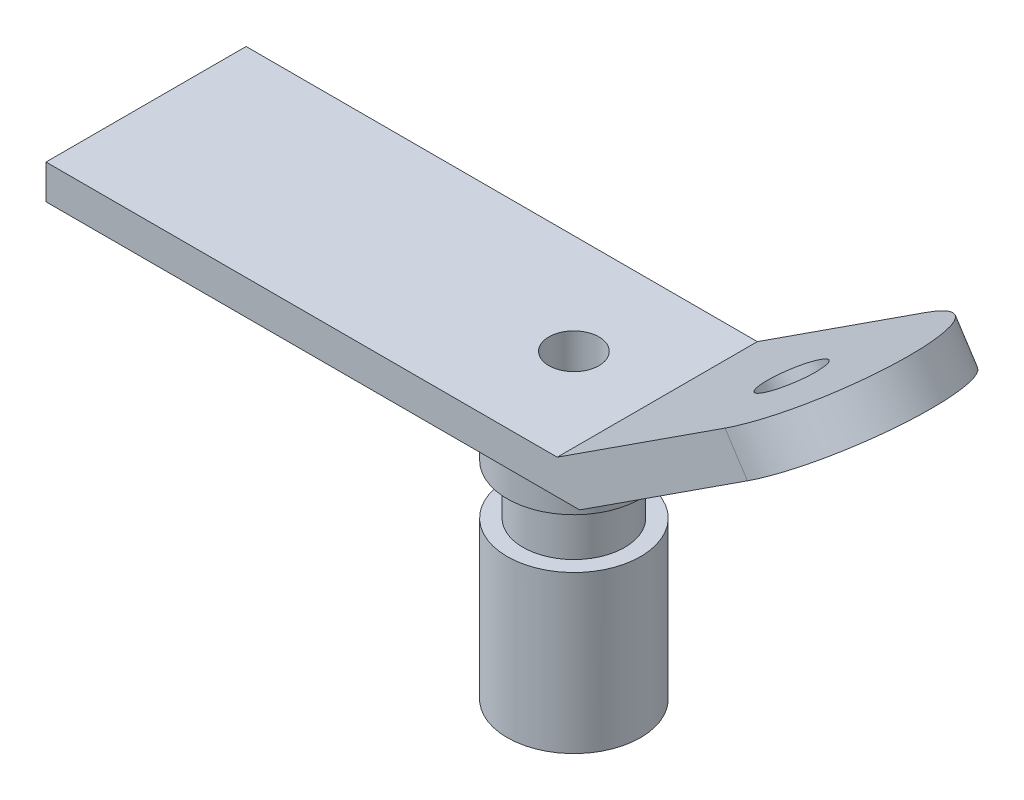
ISO-10303-21;
HEADER;
FILE_DESCRIPTION(('STEP AP214'),'2;1');
FILE_NAME('part.step','',(''),(''),'','','');
FILE_SCHEMA(('AUTOMOTIVE_DESIGN { 1 0 10303 214 1 1 1 1 }'));
ENDSEC;
DATA;
#1=APPLICATION_CONTEXT('core data for automotive mechanical design processes');
#2=APPLICATION_PROTOCOL_DEFINITION('international standard','automotive_design',2000,#1);
#3=PRODUCT_CONTEXT('',#1,'mechanical');
#4=PRODUCT('Part','Part','',(#3));
#5=PRODUCT_RELATED_PRODUCT_CATEGORY('part','',(#4));
#6=PRODUCT_DEFINITION_FORMATION('','',#4);
#7=PRODUCT_DEFINITION_CONTEXT('part definition',#1,'design');
#8=PRODUCT_DEFINITION('design','',#6,#7);
#9=PRODUCT_DEFINITION_SHAPE('','',#8);
#10=(LENGTH_UNIT() NAMED_UNIT(*) SI_UNIT(.MILLI.,.METRE.));
#11=(NAMED_UNIT(*) PLANE_ANGLE_UNIT() SI_UNIT($,.RADIAN.));
#12=(NAMED_UNIT(*) SI_UNIT($,.STERADIAN.) SOLID_ANGLE_UNIT());
#13=UNCERTAINTY_MEASURE_WITH_UNIT(LENGTH_MEASURE(1.E-05),#10,'distance_accuracy_value','');
#14=(GEOMETRIC_REPRESENTATION_CONTEXT(3) GLOBAL_UNCERTAINTY_ASSIGNED_CONTEXT((#13)) GLOBAL_UNIT_ASSIGNED_CONTEXT((#10,
#11,#12)) REPRESENTATION_CONTEXT('',''));
#15=CARTESIAN_POINT('',(0.,0.,0.));
#16=DIRECTION('',(0.,0.,1.));
#17=DIRECTION('',(1.,0.,0.));
#18=AXIS2_PLACEMENT_3D('',#15,#16,#17);
#19=CARTESIAN_POINT('',(-40.2824422143277,-101.6,38.1));
#20=DIRECTION('',(0.,1.,0.));
#21=DIRECTION('',(0.,0.,1.));
#22=AXIS2_PLACEMENT_3D('',#19,#20,#21);
#23=CYLINDRICAL_SURFACE('',#22,25.4);
#24=CARTESIAN_POINT('',(-40.2824422143277,-101.6,38.1));
#25=DIRECTION('',(0.,-1.,0.));
#26=DIRECTION('',(0.,0.,-1.));
#27=AXIS2_PLACEMENT_3D('',#24,#25,#26);
#28=CIRCLE('',#27,25.4);
#29=CARTESIAN_POINT('',(-40.2824422143277,-101.6,12.7));
#30=VERTEX_POINT('',#29);
#31=EDGE_CURVE('E119',#30,#30,#28,.T.);
#32=ORIENTED_EDGE('',*,*,#31,.F.);
#33=EDGE_LOOP('',(#32));
#34=FACE_BOUND('',#33,.T.);
#35=CARTESIAN_POINT('',(-40.2824422143277,-41.8846,38.1));
#36=DIRECTION('',(0.,1.,0.));
#37=DIRECTION('',(0.,0.,1.));
#38=AXIS2_PLACEMENT_3D('',#35,#36,#37);
#39=CIRCLE('',#38,25.4);
#40=CARTESIAN_POINT('',(-40.2824422143277,-41.8846,63.5));
#41=VERTEX_POINT('',#40);
#42=EDGE_CURVE('E137',#41,#41,#39,.T.);
#43=ORIENTED_EDGE('',*,*,#42,.F.);
#44=EDGE_LOOP('',(#43));
#45=FACE_BOUND('',#44,.T.);
#46=ADVANCED_FACE('F37',(#34,#45),#23,.T.);
#47=CARTESIAN_POINT('',(-40.2824422143277,-101.6,38.1));
#48=DIRECTION('',(0.,-1.,0.));
#49=DIRECTION('',(0.,0.,-1.));
#50=AXIS2_PLACEMENT_3D('',#47,#48,#49);
#51=PLANE('',#50);
#52=ORIENTED_EDGE('',*,*,#31,.T.);
#53=EDGE_LOOP('',(#52));
#54=FACE_BOUND('',#53,.T.);
#55=CARTESIAN_POINT('',(-40.2824422143277,-101.6,38.1));
#56=DIRECTION('',(0.,-1.,0.));
#57=DIRECTION('',(0.,0.,-1.));
#58=AXIS2_PLACEMENT_3D('',#55,#56,#57);
#59=CIRCLE('',#58,9.525);
#60=CARTESIAN_POINT('',(-40.2824422143277,-101.6,28.575));
#61=VERTEX_POINT('',#60);
#62=EDGE_CURVE('E141',#61,#61,#59,.T.);
#63=ORIENTED_EDGE('',*,*,#62,.F.);
#64=EDGE_LOOP('',(#63));
#65=FACE_BOUND('',#64,.T.);
#66=ADVANCED_FACE('F194',(#54,#65),#51,.T.);
#67=CARTESIAN_POINT('',(-40.2824422143277,-101.6,38.1));
#68=DIRECTION('',(0.,1.,0.));
#69=DIRECTION('',(0.,0.,1.));
#70=AXIS2_PLACEMENT_3D('',#67,#68,#69);
#71=CYLINDRICAL_SURFACE('',#70,9.525);
#72=ORIENTED_EDGE('',*,*,#62,.T.);
#73=EDGE_LOOP('',(#72));
#74=FACE_BOUND('',#73,.T.);
#75=CARTESIAN_POINT('',(-40.2824422143278,13.1268341758888,38.1));
#76=DIRECTION('',(0.,1.,0.));
#77=DIRECTION('',(0.,0.,1.));
#78=AXIS2_PLACEMENT_3D('',#75,#76,#77);
#79=CIRCLE('',#78,9.525);
#80=CARTESIAN_POINT('',(-40.2824422143278,13.1268341758888,47.625));
#81=VERTEX_POINT('',#80);
#82=EDGE_CURVE('E142',#81,#81,#79,.T.);
#83=ORIENTED_EDGE('',*,*,#82,.T.);
#84=EDGE_LOOP('',(#83));
#85=FACE_BOUND('',#84,.T.);
#86=ADVANCED_FACE('F201',(#74,#85),#71,.F.);
#87=CARTESIAN_POINT('',(-65.992567443697,-41.8846,38.1));
#88=DIRECTION('',(0.,1.,0.));
#89=DIRECTION('',(0.,0.,1.));
#90=AXIS2_PLACEMENT_3D('',#87,#88,#89);
#91=PLANE('',#90);
#92=CARTESIAN_POINT('',(-40.2824422143277,-41.8846,38.1));
#93=DIRECTION('',(0.,-1.,0.));
#94=DIRECTION('',(0.,0.,-1.));
#95=AXIS2_PLACEMENT_3D('',#92,#93,#94);
#96=CIRCLE('',#95,19.3601252293693);
#97=CARTESIAN_POINT('',(-40.2824422143277,-41.8846,18.7398747706307));
#98=VERTEX_POINT('',#97);
#99=EDGE_CURVE('E138',#98,#98,#96,.T.);
#100=ORIENTED_EDGE('',*,*,#99,.T.);
#101=EDGE_LOOP('',(#100));
#102=FACE_BOUND('',#101,.T.);
#103=ORIENTED_EDGE('',*,*,#42,.T.);
#104=EDGE_LOOP('',(#103));
#105=FACE_BOUND('',#104,.T.);
#106=ADVANCED_FACE('F222',(#102,#105),#91,.T.);
#107=CARTESIAN_POINT('',(-65.992567443697,-22.8346,38.1));
#108=DIRECTION('',(0.,-1.,0.));
#109=DIRECTION('',(0.,0.,-1.));
#110=AXIS2_PLACEMENT_3D('',#107,#108,#109);
#111=PLANE('',#110);
#112=CARTESIAN_POINT('',(-40.2824422143277,-22.8346,38.1));
#113=DIRECTION('',(0.,-1.,0.));
#114=DIRECTION('',(0.,0.,-1.));
#115=AXIS2_PLACEMENT_3D('',#112,#113,#114);
#116=CIRCLE('',#115,19.3601252293693);
#117=CARTESIAN_POINT('',(-40.2824422143277,-22.8346,18.7398747706307));
#118=VERTEX_POINT('',#117);
#119=EDGE_CURVE('E144',#118,#118,#116,.T.);
#120=ORIENTED_EDGE('',*,*,#119,.F.);
#121=EDGE_LOOP('',(#120));
#122=FACE_BOUND('',#121,.T.);
#123=CARTESIAN_POINT('',(-40.2824422143277,-22.8346,38.1));
#124=DIRECTION('',(0.,-1.,0.));
#125=DIRECTION('',(0.,0.,-1.));
#126=AXIS2_PLACEMENT_3D('',#123,#124,#125);
#127=CIRCLE('',#126,25.4);
#128=CARTESIAN_POINT('',(-40.2824422143277,-22.8346,12.7));
#129=VERTEX_POINT('',#128);
#130=EDGE_CURVE('E134',#129,#129,#127,.T.);
#131=ORIENTED_EDGE('',*,*,#130,.T.);
#132=EDGE_LOOP('',(#131));
#133=FACE_BOUND('',#132,.T.);
#134=ADVANCED_FACE('F219',(#122,#133),#111,.T.);
#135=CARTESIAN_POINT('',(-40.2824422143277,-101.6,38.1));
#136=DIRECTION('',(0.,-1.,0.));
#137=DIRECTION('',(0.,0.,-1.));
#138=AXIS2_PLACEMENT_3D('',#135,#136,#137);
#139=CYLINDRICAL_SURFACE('',#138,19.3601252293693);
#140=ORIENTED_EDGE('',*,*,#119,.T.);
#141=EDGE_LOOP('',(#140));
#142=FACE_BOUND('',#141,.T.);
#143=ORIENTED_EDGE('',*,*,#99,.F.);
#144=EDGE_LOOP('',(#143));
#145=FACE_BOUND('',#144,.T.);
#146=ADVANCED_FACE('F221',(#142,#145),#139,.T.);
#147=CARTESIAN_POINT('',(-8.53244221432774,13.1268341758888,76.2));
#148=DIRECTION('',(0.544988350595414,-0.838443616300637,0.));
#149=DIRECTION('',(0.838443616300637,0.544988350595414,0.));
#150=AXIS2_PLACEMENT_3D('',#147,#148,#149);
#151=PLANE('',#150);
#152=CARTESIAN_POINT('',(42.6216735710671,46.3770094363955,38.1));
#153=DIRECTION('',(-0.544988350595415,0.838443616300637,0.));
#154=DIRECTION('',(-0.838443616300637,-0.544988350595415,0.));
#155=AXIS2_PLACEMENT_3D('',#152,#153,#154);
#156=CIRCLE('',#155,10.9982);
#157=CARTESIAN_POINT('',(33.4003029902695,40.3831185588771,38.1));
#158=VERTEX_POINT('',#157);
#159=EDGE_CURVE('E147',#158,#158,#156,.T.);
#160=ORIENTED_EDGE('',*,*,#159,.F.);
#161=EDGE_LOOP('',(#160));
#162=FACE_BOUND('',#161,.T.);
#163=DIRECTION('',(-0.838443616300637,-0.544988350595414,0.));
#164=VECTOR('',#163,1.);
#165=CARTESIAN_POINT('',(-8.53244221432774,13.1268341758888,76.2));
#166=LINE('',#165,#164);
#167=CARTESIAN_POINT('',(55.3569613477808,54.6549464912594,76.2));
#168=VERTEX_POINT('',#167);
#169=CARTESIAN_POINT('',(-8.53244221432774,13.1268341758888,76.2));
#170=VERTEX_POINT('',#169);
#171=EDGE_CURVE('E60',#168,#170,#166,.T.);
#172=ORIENTED_EDGE('',*,*,#171,.F.);
#173=CARTESIAN_POINT('',(55.3569613477808,54.6549464912594,38.1));
#174=DIRECTION('',(0.544988350595415,-0.838443616300637,0.));
#175=DIRECTION('',(0.838443616300637,0.544988350595415,0.));
#176=AXIS2_PLACEMENT_3D('',#173,#174,#175);
#177=CIRCLE('',#176,38.1);
#178=CARTESIAN_POINT('',(55.3569613477808,54.6549464912594,0.));
#179=VERTEX_POINT('',#178);
#180=EDGE_CURVE('E96',#179,#168,#177,.T.);
#181=ORIENTED_EDGE('',*,*,#180,.F.);
#182=DIRECTION('',(-0.838443616300637,-0.544988350595414,0.));
#183=VECTOR('',#182,1.);
#184=CARTESIAN_POINT('',(-8.53244221432774,13.1268341758888,0.));
#185=LINE('',#184,#183);
#186=CARTESIAN_POINT('',(-8.53244221432774,13.1268341758888,0.));
#187=VERTEX_POINT('',#186);
#188=EDGE_CURVE('E82',#179,#187,#185,.T.);
#189=ORIENTED_EDGE('',*,*,#188,.T.);
#190=DIRECTION('',(0.,0.,-1.));
#191=VECTOR('',#190,1.);
#192=CARTESIAN_POINT('',(-8.53244221432774,13.1268341758888,76.2));
#193=LINE('',#192,#191);
#194=EDGE_CURVE('E107',#170,#187,#193,.T.);
#195=ORIENTED_EDGE('',*,*,#194,.F.);
#196=EDGE_LOOP('',(#172,#181,#189,#195));
#197=FACE_BOUND('',#196,.T.);
#198=ADVANCED_FACE('F106',(#162,#197),#151,.F.);
#199=CARTESIAN_POINT('',(0.,13.1268341758888,76.2));
#200=DIRECTION('',(0.,1.,0.));
#201=DIRECTION('',(0.,0.,1.));
#202=AXIS2_PLACEMENT_3D('',#199,#200,#201);
#203=PLANE('',#202);
#204=ORIENTED_EDGE('',*,*,#82,.F.);
#205=EDGE_LOOP('',(#204));
#206=FACE_BOUND('',#205,.T.);
#207=DIRECTION('',(1.,0.,0.));
#208=VECTOR('',#207,1.);
#209=CARTESIAN_POINT('',(0.,13.1268341758888,0.));
#210=LINE('',#209,#208);
#211=CARTESIAN_POINT('',(-203.2,13.1268341758888,0.));
#212=VERTEX_POINT('',#211);
#213=EDGE_CURVE('E115',#212,#187,#210,.T.);
#214=ORIENTED_EDGE('',*,*,#213,.F.);
#215=DIRECTION('',(0.,0.,-1.));
#216=VECTOR('',#215,1.);
#217=CARTESIAN_POINT('',(-203.2,13.1268341758888,76.2));
#218=LINE('',#217,#216);
#219=CARTESIAN_POINT('',(-203.2,13.1268341758888,76.2));
#220=VERTEX_POINT('',#219);
#221=EDGE_CURVE('E45',#220,#212,#218,.T.);
#222=ORIENTED_EDGE('',*,*,#221,.F.);
#223=DIRECTION('',(1.,0.,0.));
#224=VECTOR('',#223,1.);
#225=CARTESIAN_POINT('',(0.,13.1268341758888,76.2));
#226=LINE('',#225,#224);
#227=EDGE_CURVE('E128',#220,#170,#226,.T.);
#228=ORIENTED_EDGE('',*,*,#227,.T.);
#229=ORIENTED_EDGE('',*,*,#194,.T.);
#230=EDGE_LOOP('',(#214,#222,#228,#229));
#231=FACE_BOUND('',#230,.T.);
#232=ADVANCED_FACE('F39',(#206,#231),#203,.T.);
#233=CARTESIAN_POINT('',(-203.2,0.,76.2));
#234=DIRECTION('',(-1.,0.,0.));
#235=DIRECTION('',(0.,0.,1.));
#236=AXIS2_PLACEMENT_3D('',#233,#234,#235);
#237=PLANE('',#236);
#238=DIRECTION('',(0.,1.,0.));
#239=VECTOR('',#238,1.);
#240=CARTESIAN_POINT('',(-203.2,0.,0.));
#241=LINE('',#240,#239);
#242=CARTESIAN_POINT('',(-203.2,0.,0.));
#243=VERTEX_POINT('',#242);
#244=EDGE_CURVE('E118',#243,#212,#241,.T.);
#245=ORIENTED_EDGE('',*,*,#244,.F.);
#246=DIRECTION('',(0.,0.,-1.));
#247=VECTOR('',#246,1.);
#248=CARTESIAN_POINT('',(-203.2,0.,76.2));
#249=LINE('',#248,#247);
#250=CARTESIAN_POINT('',(-203.2,0.,76.2));
#251=VERTEX_POINT('',#250);
#252=EDGE_CURVE('E131',#251,#243,#249,.T.);
#253=ORIENTED_EDGE('',*,*,#252,.F.);
#254=DIRECTION('',(0.,1.,0.));
#255=VECTOR('',#254,1.);
#256=CARTESIAN_POINT('',(-203.2,0.,76.2));
#257=LINE('',#256,#255);
#258=EDGE_CURVE('E168',#251,#220,#257,.T.);
#259=ORIENTED_EDGE('',*,*,#258,.T.);
#260=ORIENTED_EDGE('',*,*,#221,.T.);
#261=EDGE_LOOP('',(#245,#253,#259,#260));
#262=FACE_BOUND('',#261,.T.);
#263=ADVANCED_FACE('F177',(#262),#237,.T.);
#264=CARTESIAN_POINT('',(0.,0.,76.2));
#265=DIRECTION('',(0.,0.,1.));
#266=DIRECTION('',(1.,0.,0.));
#267=AXIS2_PLACEMENT_3D('',#264,#265,#266);
#268=PLANE('',#267);
#269=DIRECTION('',(-0.544988350595415,0.838443616300637,0.));
#270=VECTOR('',#269,1.);
#271=CARTESIAN_POINT('',(148.266588806384,-88.2829419065916,76.2));
#272=LINE('',#271,#270);
#273=CARTESIAN_POINT('',(63.8894035621085,41.5281123153706,76.2));
#274=VERTEX_POINT('',#273);
#275=EDGE_CURVE('E98',#274,#168,#272,.T.);
#276=ORIENTED_EDGE('',*,*,#275,.T.);
#277=ORIENTED_EDGE('',*,*,#171,.T.);
#278=ORIENTED_EDGE('',*,*,#227,.F.);
#279=ORIENTED_EDGE('',*,*,#258,.F.);
#280=DIRECTION('',(-1.,0.,0.));
#281=VECTOR('',#280,1.);
#282=CARTESIAN_POINT('',(0.,0.,76.2));
#283=LINE('',#282,#281);
#284=CARTESIAN_POINT('',(0.,0.,76.2));
#285=VERTEX_POINT('',#284);
#286=EDGE_CURVE('E111',#285,#251,#283,.T.);
#287=ORIENTED_EDGE('',*,*,#286,.F.);
#288=DIRECTION('',(0.838443616300637,0.544988350595415,0.));
#289=VECTOR('',#288,1.);
#290=CARTESIAN_POINT('',(0.,0.,76.2));
#291=LINE('',#290,#289);
#292=EDGE_CURVE('E104',#285,#274,#291,.T.);
#293=ORIENTED_EDGE('',*,*,#292,.T.);
#294=EDGE_LOOP('',(#276,#277,#278,#279,#287,#293));
#295=FACE_BOUND('',#294,.T.);
#296=ADVANCED_FACE('F101',(#295),#268,.T.);
#297=CARTESIAN_POINT('',(0.,0.,76.2));
#298=DIRECTION('',(-0.544988350595415,0.838443616300637,0.));
#299=DIRECTION('',(-0.838443616300637,-0.544988350595415,0.));
#300=AXIS2_PLACEMENT_3D('',#297,#298,#299);
#301=PLANE('',#300);
#302=CARTESIAN_POINT('',(51.1541157853949,33.2501752605067,38.1));
#303=DIRECTION('',(-0.544988350595415,0.838443616300637,0.));
#304=DIRECTION('',(-0.838443616300637,-0.544988350595415,0.));
#305=AXIS2_PLACEMENT_3D('',#302,#303,#304);
#306=CIRCLE('',#305,10.9982);
#307=CARTESIAN_POINT('',(41.9327452045972,27.2562843829883,38.1));
#308=VERTEX_POINT('',#307);
#309=EDGE_CURVE('E145',#308,#308,#306,.T.);
#310=ORIENTED_EDGE('',*,*,#309,.T.);
#311=EDGE_LOOP('',(#310));
#312=FACE_BOUND('',#311,.T.);
#313=DIRECTION('',(0.838443616300637,0.544988350595415,0.));
#314=VECTOR('',#313,1.);
#315=CARTESIAN_POINT('',(0.,0.,0.));
#316=LINE('',#315,#314);
#317=CARTESIAN_POINT('',(0.,0.,0.));
#318=VERTEX_POINT('',#317);
#319=CARTESIAN_POINT('',(63.8894035621085,41.5281123153706,0.));
#320=VERTEX_POINT('',#319);
#321=EDGE_CURVE('E125',#318,#320,#316,.T.);
#322=ORIENTED_EDGE('',*,*,#321,.T.);
#323=CARTESIAN_POINT('',(63.8894035621085,41.5281123153706,38.1));
#324=DIRECTION('',(-0.544988350595415,0.838443616300637,0.));
#325=DIRECTION('',(-0.838443616300637,-0.544988350595415,0.));
#326=AXIS2_PLACEMENT_3D('',#323,#324,#325);
#327=CIRCLE('',#326,38.1);
#328=EDGE_CURVE('E52',#320,#274,#327,.F.);
#329=ORIENTED_EDGE('',*,*,#328,.T.);
#330=ORIENTED_EDGE('',*,*,#292,.F.);
#331=DIRECTION('',(0.,0.,-1.));
#332=VECTOR('',#331,1.);
#333=CARTESIAN_POINT('',(0.,0.,76.2));
#334=LINE('',#333,#332);
#335=EDGE_CURVE('E109',#285,#318,#334,.T.);
#336=ORIENTED_EDGE('',*,*,#335,.T.);
#337=EDGE_LOOP('',(#322,#329,#330,#336));
#338=FACE_BOUND('',#337,.T.);
#339=ADVANCED_FACE('F182',(#312,#338),#301,.F.);
#340=CARTESIAN_POINT('',(0.,0.,0.));
#341=DIRECTION('',(0.,0.,1.));
#342=DIRECTION('',(1.,0.,0.));
#343=AXIS2_PLACEMENT_3D('',#340,#341,#342);
#344=PLANE('',#343);
#345=ORIENTED_EDGE('',*,*,#188,.F.);
#346=DIRECTION('',(-0.544988350595415,0.838443616300637,0.));
#347=VECTOR('',#346,1.);
#348=CARTESIAN_POINT('',(148.266588806384,-88.2829419065916,0.));
#349=LINE('',#348,#347);
#350=EDGE_CURVE('E11',#179,#320,#349,.F.);
#351=ORIENTED_EDGE('',*,*,#350,.T.);
#352=ORIENTED_EDGE('',*,*,#321,.F.);
#353=DIRECTION('',(-1.,0.,0.));
#354=VECTOR('',#353,1.);
#355=CARTESIAN_POINT('',(0.,0.,0.));
#356=LINE('',#355,#354);
#357=EDGE_CURVE('E122',#318,#243,#356,.T.);
#358=ORIENTED_EDGE('',*,*,#357,.T.);
#359=ORIENTED_EDGE('',*,*,#244,.T.);
#360=ORIENTED_EDGE('',*,*,#213,.T.);
#361=EDGE_LOOP('',(#345,#351,#352,#358,#359,#360));
#362=FACE_BOUND('',#361,.T.);
#363=ADVANCED_FACE('F180',(#362),#344,.F.);
#364=CARTESIAN_POINT('',(0.,0.,76.2));
#365=DIRECTION('',(0.,-1.,0.));
#366=DIRECTION('',(1.,0.,0.));
#367=AXIS2_PLACEMENT_3D('',#364,#365,#366);
#368=PLANE('',#367);
#369=CARTESIAN_POINT('',(-40.2824422143277,0.,38.1));
#370=DIRECTION('',(0.,-1.,0.));
#371=DIRECTION('',(0.,0.,-1.));
#372=AXIS2_PLACEMENT_3D('',#369,#370,#371);
#373=CIRCLE('',#372,25.4);
#374=CARTESIAN_POINT('',(-40.2824422143277,0.,12.7));
#375=VERTEX_POINT('',#374);
#376=EDGE_CURVE('E162',#375,#375,#373,.T.);
#377=ORIENTED_EDGE('',*,*,#376,.F.);
#378=EDGE_LOOP('',(#377));
#379=FACE_BOUND('',#378,.T.);
#380=ORIENTED_EDGE('',*,*,#357,.F.);
#381=ORIENTED_EDGE('',*,*,#335,.F.);
#382=ORIENTED_EDGE('',*,*,#286,.T.);
#383=ORIENTED_EDGE('',*,*,#252,.T.);
#384=EDGE_LOOP('',(#380,#381,#382,#383));
#385=FACE_BOUND('',#384,.T.);
#386=ADVANCED_FACE('F173',(#379,#385),#368,.T.);
#387=ORIENTED_EDGE('',*,*,#376,.T.);
#388=EDGE_LOOP('',(#387));
#389=FACE_BOUND('',#388,.T.);
#390=ORIENTED_EDGE('',*,*,#130,.F.);
#391=EDGE_LOOP('',(#390));
#392=FACE_BOUND('',#391,.T.);
#393=ADVANCED_FACE('F197',(#389,#392),#23,.T.);
#394=CARTESIAN_POINT('',(135.53130102967,-96.5608789614554,38.1));
#395=DIRECTION('',(-0.544988350595415,0.838443616300637,0.));
#396=DIRECTION('',(-0.838443616300637,-0.544988350595415,0.));
#397=AXIS2_PLACEMENT_3D('',#394,#395,#396);
#398=CYLINDRICAL_SURFACE('',#397,10.9982);
#399=ORIENTED_EDGE('',*,*,#159,.T.);
#400=EDGE_LOOP('',(#399));
#401=FACE_BOUND('',#400,.T.);
#402=ORIENTED_EDGE('',*,*,#309,.F.);
#403=EDGE_LOOP('',(#402));
#404=FACE_BOUND('',#403,.T.);
#405=ADVANCED_FACE('F207',(#401,#404),#398,.F.);
#406=CARTESIAN_POINT('',(148.266588806384,-88.2829419065916,38.1));
#407=DIRECTION('',(-0.544988350595415,0.838443616300637,0.));
#408=DIRECTION('',(-0.838443616300637,-0.544988350595415,0.));
#409=AXIS2_PLACEMENT_3D('',#406,#407,#408);
#410=CYLINDRICAL_SURFACE('',#409,38.1);
#411=ORIENTED_EDGE('',*,*,#350,.F.);
#412=ORIENTED_EDGE('',*,*,#180,.T.);
#413=ORIENTED_EDGE('',*,*,#275,.F.);
#414=ORIENTED_EDGE('',*,*,#328,.F.);
#415=EDGE_LOOP('',(#411,#412,#413,#414));
#416=FACE_BOUND('',#415,.T.);
#417=ADVANCED_FACE('F97',(#416),#410,.T.);
#418=CLOSED_SHELL('',(#46,#66,#86,#106,#134,#146,#198,#232,#263,#296,#339,#363,#386,#393,#405,#417));
#419=MANIFOLD_SOLID_BREP('B2',#418);
#420=ADVANCED_BREP_SHAPE_REPRESENTATION('',(#18,#419),#14);
#421=SHAPE_DEFINITION_REPRESENTATION(#9,#420);
ENDSEC;
END-ISO-10303-21;
